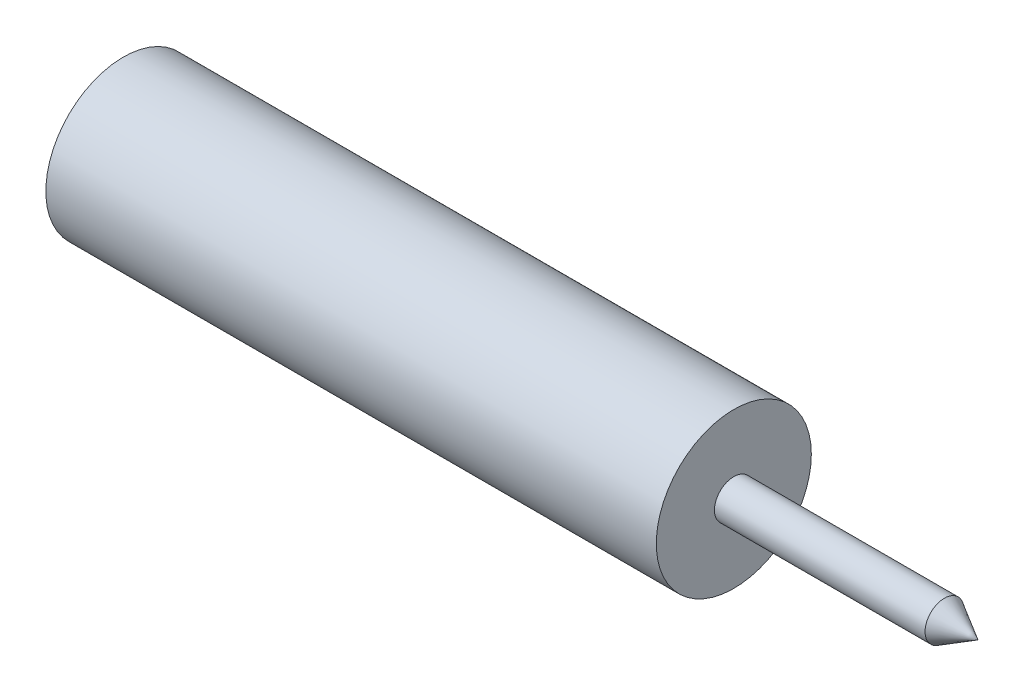
ISO-10303-21;
HEADER;
FILE_DESCRIPTION(('STEP AP214'),'2;1');
FILE_NAME('part.step','',(''),(''),'','','');
FILE_SCHEMA(('AUTOMOTIVE_DESIGN { 1 0 10303 214 1 1 1 1 }'));
ENDSEC;
DATA;
#1=APPLICATION_CONTEXT('core data for automotive mechanical design processes');
#2=APPLICATION_PROTOCOL_DEFINITION('international standard','automotive_design',2000,#1);
#3=PRODUCT_CONTEXT('',#1,'mechanical');
#4=PRODUCT('Part','Part','',(#3));
#5=PRODUCT_RELATED_PRODUCT_CATEGORY('part','',(#4));
#6=PRODUCT_DEFINITION_FORMATION('','',#4);
#7=PRODUCT_DEFINITION_CONTEXT('part definition',#1,'design');
#8=PRODUCT_DEFINITION('design','',#6,#7);
#9=PRODUCT_DEFINITION_SHAPE('','',#8);
#10=(LENGTH_UNIT() NAMED_UNIT(*) SI_UNIT(.MILLI.,.METRE.));
#11=(NAMED_UNIT(*) PLANE_ANGLE_UNIT() SI_UNIT($,.RADIAN.));
#12=(NAMED_UNIT(*) SI_UNIT($,.STERADIAN.) SOLID_ANGLE_UNIT());
#13=UNCERTAINTY_MEASURE_WITH_UNIT(LENGTH_MEASURE(1.E-05),#10,'distance_accuracy_value','');
#14=(GEOMETRIC_REPRESENTATION_CONTEXT(3) GLOBAL_UNCERTAINTY_ASSIGNED_CONTEXT((#13)) GLOBAL_UNIT_ASSIGNED_CONTEXT((#10,
#11,#12)) REPRESENTATION_CONTEXT('',''));
#15=CARTESIAN_POINT('',(0.,0.,0.));
#16=DIRECTION('',(0.,0.,1.));
#17=DIRECTION('',(1.,0.,0.));
#18=AXIS2_PLACEMENT_3D('',#15,#16,#17);
#19=CARTESIAN_POINT('',(0.,0.,0.));
#20=DIRECTION('',(-1.,0.,0.));
#21=DIRECTION('',(0.,0.,1.));
#22=AXIS2_PLACEMENT_3D('',#19,#20,#21);
#23=PLANE('',#22);
#24=CARTESIAN_POINT('',(0.,0.,0.));
#25=DIRECTION('',(1.,0.,0.));
#26=DIRECTION('',(0.,0.,-1.));
#27=AXIS2_PLACEMENT_3D('',#24,#25,#26);
#28=CIRCLE('',#27,6.35);
#29=CARTESIAN_POINT('',(0.,0.,-6.35));
#30=VERTEX_POINT('',#29);
#31=EDGE_CURVE('E11',#30,#30,#28,.T.);
#32=ORIENTED_EDGE('',*,*,#31,.F.);
#33=EDGE_LOOP('',(#32));
#34=FACE_BOUND('',#33,.T.);
#35=ADVANCED_FACE('F45',(#34),#23,.T.);
#36=CARTESIAN_POINT('',(0.,0.,0.));
#37=DIRECTION('',(1.,0.,0.));
#38=DIRECTION('',(0.,0.,-1.));
#39=AXIS2_PLACEMENT_3D('',#36,#37,#38);
#40=CYLINDRICAL_SURFACE('',#39,6.35);
#41=ORIENTED_EDGE('',*,*,#31,.T.);
#42=EDGE_LOOP('',(#41));
#43=FACE_BOUND('',#42,.T.);
#44=CARTESIAN_POINT('',(50.,0.,0.));
#45=DIRECTION('',(1.,0.,0.));
#46=DIRECTION('',(0.,0.,-1.));
#47=AXIS2_PLACEMENT_3D('',#44,#45,#46);
#48=CIRCLE('',#47,6.35);
#49=CARTESIAN_POINT('',(50.,0.,-6.35));
#50=VERTEX_POINT('',#49);
#51=EDGE_CURVE('E52',#50,#50,#48,.T.);
#52=ORIENTED_EDGE('',*,*,#51,.F.);
#53=EDGE_LOOP('',(#52));
#54=FACE_BOUND('',#53,.T.);
#55=ADVANCED_FACE('F68',(#43,#54),#40,.T.);
#56=CARTESIAN_POINT('',(50.,6.35,0.));
#57=DIRECTION('',(1.,0.,0.));
#58=DIRECTION('',(0.,0.,-1.));
#59=AXIS2_PLACEMENT_3D('',#56,#57,#58);
#60=PLANE('',#59);
#61=ORIENTED_EDGE('',*,*,#51,.T.);
#62=EDGE_LOOP('',(#61));
#63=FACE_BOUND('',#62,.T.);
#64=CARTESIAN_POINT('',(50.,0.,0.));
#65=DIRECTION('',(1.,0.,0.));
#66=DIRECTION('',(0.,0.,-1.));
#67=AXIS2_PLACEMENT_3D('',#64,#65,#66);
#68=CIRCLE('',#67,1.58750000000001);
#69=CARTESIAN_POINT('',(50.,0.,-1.58750000000001));
#70=VERTEX_POINT('',#69);
#71=EDGE_CURVE('E80',#70,#70,#68,.T.);
#72=ORIENTED_EDGE('',*,*,#71,.F.);
#73=EDGE_LOOP('',(#72));
#74=FACE_BOUND('',#73,.T.);
#75=ADVANCED_FACE('F63',(#63,#74),#60,.T.);
#76=CARTESIAN_POINT('',(0.,0.,0.));
#77=DIRECTION('',(1.,0.,0.));
#78=DIRECTION('',(0.,0.,-1.));
#79=AXIS2_PLACEMENT_3D('',#76,#77,#78);
#80=CYLINDRICAL_SURFACE('',#79,1.58750000000001);
#81=ORIENTED_EDGE('',*,*,#71,.T.);
#82=EDGE_LOOP('',(#81));
#83=FACE_BOUND('',#82,.T.);
#84=CARTESIAN_POINT('',(67.2503693429843,0.,0.));
#85=DIRECTION('',(1.,0.,0.));
#86=DIRECTION('',(0.,0.,-1.));
#87=AXIS2_PLACEMENT_3D('',#84,#85,#86);
#88=CIRCLE('',#87,1.58750000000001);
#89=CARTESIAN_POINT('',(67.2503693429843,0.,-1.58750000000001));
#90=VERTEX_POINT('',#89);
#91=EDGE_CURVE('E83',#90,#90,#88,.T.);
#92=ORIENTED_EDGE('',*,*,#91,.F.);
#93=EDGE_LOOP('',(#92));
#94=FACE_BOUND('',#93,.T.);
#95=ADVANCED_FACE('F57',(#83,#94),#80,.T.);
#96=CARTESIAN_POINT('',(70.,0.,0.));
#97=DIRECTION('',(-1.,0.,0.));
#98=DIRECTION('',(0.,0.,1.));
#99=AXIS2_PLACEMENT_3D('',#96,#97,#98);
#100=CONICAL_SURFACE('',#99,0.,0.523598775598289);
#101=ORIENTED_EDGE('',*,*,#91,.T.);
#102=EDGE_LOOP('',(#101));
#103=FACE_BOUND('',#102,.T.);
#104=CARTESIAN_POINT('',(70.,0.,0.));
#105=VERTEX_POINT('',#104);
#106=VERTEX_LOOP('',#105);
#107=FACE_BOUND('',#106,.T.);
#108=ADVANCED_FACE('F55',(#103,#107),#100,.T.);
#109=CLOSED_SHELL('',(#35,#55,#75,#95,#108));
#110=MANIFOLD_SOLID_BREP('B2',#109);
#111=ADVANCED_BREP_SHAPE_REPRESENTATION('',(#18,#110),#14);
#112=SHAPE_DEFINITION_REPRESENTATION(#9,#111);
ENDSEC;
END-ISO-10303-21;
